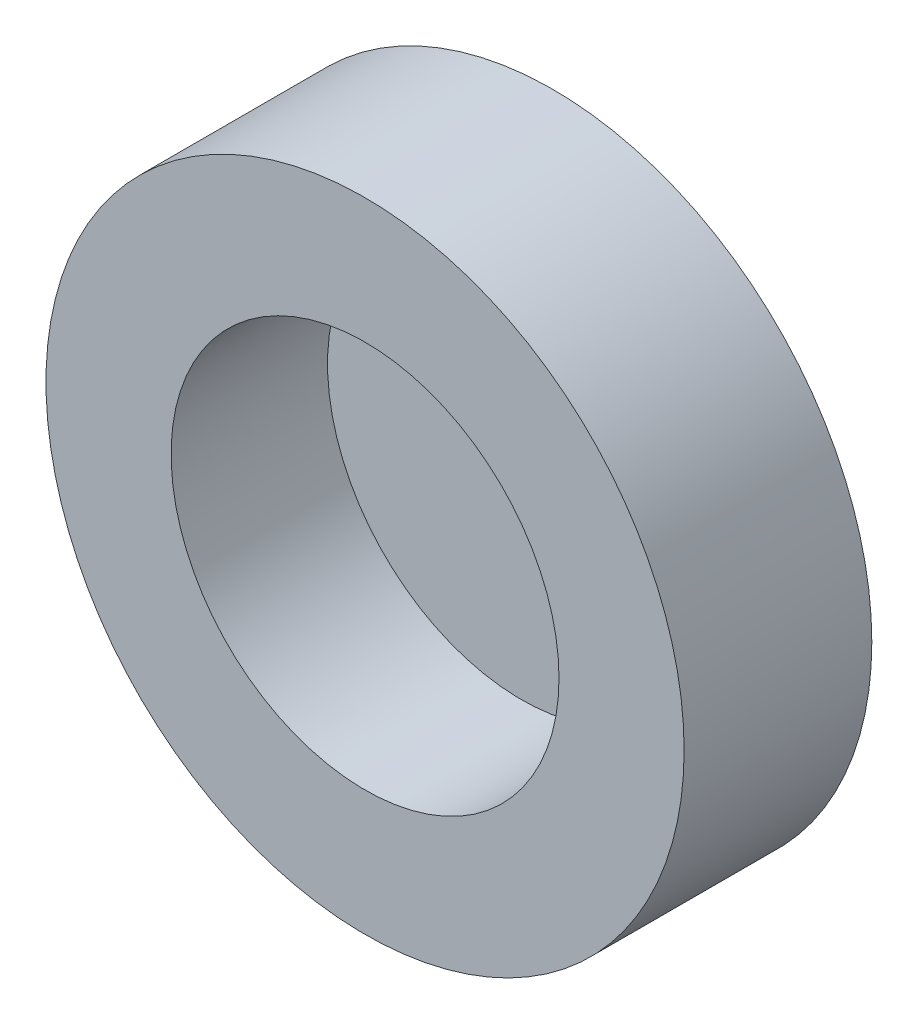
ISO-10303-21;
HEADER;
FILE_DESCRIPTION(('STEP AP214'),'2;1');
FILE_NAME('part.step','',(''),(''),'','','');
FILE_SCHEMA(('AUTOMOTIVE_DESIGN { 1 0 10303 214 1 1 1 1 }'));
ENDSEC;
DATA;
#1=APPLICATION_CONTEXT('core data for automotive mechanical design processes');
#2=APPLICATION_PROTOCOL_DEFINITION('international standard','automotive_design',2000,#1);
#3=PRODUCT_CONTEXT('',#1,'mechanical');
#4=PRODUCT('Part','Part','',(#3));
#5=PRODUCT_RELATED_PRODUCT_CATEGORY('part','',(#4));
#6=PRODUCT_DEFINITION_FORMATION('','',#4);
#7=PRODUCT_DEFINITION_CONTEXT('part definition',#1,'design');
#8=PRODUCT_DEFINITION('design','',#6,#7);
#9=PRODUCT_DEFINITION_SHAPE('','',#8);
#10=(LENGTH_UNIT() NAMED_UNIT(*) SI_UNIT(.MILLI.,.METRE.));
#11=(NAMED_UNIT(*) PLANE_ANGLE_UNIT() SI_UNIT($,.RADIAN.));
#12=(NAMED_UNIT(*) SI_UNIT($,.STERADIAN.) SOLID_ANGLE_UNIT());
#13=UNCERTAINTY_MEASURE_WITH_UNIT(LENGTH_MEASURE(1.E-05),#10,'distance_accuracy_value','');
#14=(GEOMETRIC_REPRESENTATION_CONTEXT(3) GLOBAL_UNCERTAINTY_ASSIGNED_CONTEXT((#13)) GLOBAL_UNIT_ASSIGNED_CONTEXT((#10,
#11,#12)) REPRESENTATION_CONTEXT('',''));
#15=CARTESIAN_POINT('',(0.,0.,0.));
#16=DIRECTION('',(0.,0.,1.));
#17=DIRECTION('',(1.,0.,0.));
#18=AXIS2_PLACEMENT_3D('',#15,#16,#17);
#19=CARTESIAN_POINT('',(0.,0.,5.5));
#20=DIRECTION('',(0.,0.,-1.));
#21=DIRECTION('',(-1.,0.,0.));
#22=AXIS2_PLACEMENT_3D('',#19,#20,#21);
#23=CYLINDRICAL_SURFACE('',#22,1.);
#24=CARTESIAN_POINT('',(0.,0.,0.));
#25=DIRECTION('',(0.,0.,1.));
#26=DIRECTION('',(1.,0.,0.));
#27=AXIS2_PLACEMENT_3D('',#24,#25,#26);
#28=CIRCLE('',#27,1.);
#29=CARTESIAN_POINT('',(1.,0.,0.));
#30=VERTEX_POINT('',#29);
#31=EDGE_CURVE('E44',#30,#30,#28,.T.);
#32=ORIENTED_EDGE('',*,*,#31,.T.);
#33=EDGE_LOOP('',(#32));
#34=FACE_BOUND('',#33,.T.);
#35=CARTESIAN_POINT('',(0.,0.,2.5));
#36=DIRECTION('',(0.,0.,1.));
#37=DIRECTION('',(1.,0.,0.));
#38=AXIS2_PLACEMENT_3D('',#35,#36,#37);
#39=CIRCLE('',#38,1.);
#40=CARTESIAN_POINT('',(1.,0.,2.5));
#41=VERTEX_POINT('',#40);
#42=EDGE_CURVE('E10',#41,#41,#39,.T.);
#43=ORIENTED_EDGE('',*,*,#42,.F.);
#44=EDGE_LOOP('',(#43));
#45=FACE_BOUND('',#44,.T.);
#46=ADVANCED_FACE('F37',(#34,#45),#23,.T.);
#47=CARTESIAN_POINT('',(0.,0.,0.));
#48=DIRECTION('',(0.,0.,1.));
#49=DIRECTION('',(1.,0.,0.));
#50=AXIS2_PLACEMENT_3D('',#47,#48,#49);
#51=PLANE('',#50);
#52=ORIENTED_EDGE('',*,*,#31,.F.);
#53=EDGE_LOOP('',(#52));
#54=FACE_BOUND('',#53,.T.);
#55=ADVANCED_FACE('F86',(#54),#51,.F.);
#56=CARTESIAN_POINT('',(0.,0.,2.5));
#57=DIRECTION('',(0.,0.,1.));
#58=DIRECTION('',(1.,0.,0.));
#59=AXIS2_PLACEMENT_3D('',#56,#57,#58);
#60=CYLINDRICAL_SURFACE('',#59,5.1);
#61=CARTESIAN_POINT('',(0.,0.,2.5));
#62=DIRECTION('',(0.,0.,1.));
#63=DIRECTION('',(1.,0.,0.));
#64=AXIS2_PLACEMENT_3D('',#61,#62,#63);
#65=CIRCLE('',#64,5.1);
#66=CARTESIAN_POINT('',(5.1,0.,2.5));
#67=VERTEX_POINT('',#66);
#68=EDGE_CURVE('E49',#67,#67,#65,.T.);
#69=ORIENTED_EDGE('',*,*,#68,.T.);
#70=EDGE_LOOP('',(#69));
#71=FACE_BOUND('',#70,.T.);
#72=CARTESIAN_POINT('',(0.,0.,5.5));
#73=DIRECTION('',(0.,0.,1.));
#74=DIRECTION('',(1.,0.,0.));
#75=AXIS2_PLACEMENT_3D('',#72,#73,#74);
#76=CIRCLE('',#75,5.1);
#77=CARTESIAN_POINT('',(5.1,0.,5.5));
#78=VERTEX_POINT('',#77);
#79=EDGE_CURVE('E54',#78,#78,#76,.T.);
#80=ORIENTED_EDGE('',*,*,#79,.F.);
#81=EDGE_LOOP('',(#80));
#82=FACE_BOUND('',#81,.T.);
#83=ADVANCED_FACE('F84',(#71,#82),#60,.T.);
#84=CARTESIAN_POINT('',(0.,0.,2.5));
#85=DIRECTION('',(0.,0.,1.));
#86=DIRECTION('',(1.,0.,0.));
#87=AXIS2_PLACEMENT_3D('',#84,#85,#86);
#88=PLANE('',#87);
#89=ORIENTED_EDGE('',*,*,#42,.T.);
#90=EDGE_LOOP('',(#89));
#91=FACE_BOUND('',#90,.T.);
#92=ORIENTED_EDGE('',*,*,#68,.F.);
#93=EDGE_LOOP('',(#92));
#94=FACE_BOUND('',#93,.T.);
#95=ADVANCED_FACE('F80',(#91,#94),#88,.F.);
#96=CARTESIAN_POINT('',(0.,0.,5.5));
#97=DIRECTION('',(0.,0.,1.));
#98=DIRECTION('',(1.,0.,0.));
#99=AXIS2_PLACEMENT_3D('',#96,#97,#98);
#100=PLANE('',#99);
#101=CARTESIAN_POINT('',(0.,0.,5.5));
#102=DIRECTION('',(0.,0.,1.));
#103=DIRECTION('',(1.,0.,0.));
#104=AXIS2_PLACEMENT_3D('',#101,#102,#103);
#105=CIRCLE('',#104,3.1);
#106=CARTESIAN_POINT('',(3.1,0.,5.5));
#107=VERTEX_POINT('',#106);
#108=EDGE_CURVE('E61',#107,#107,#105,.T.);
#109=ORIENTED_EDGE('',*,*,#108,.F.);
#110=EDGE_LOOP('',(#109));
#111=FACE_BOUND('',#110,.T.);
#112=ORIENTED_EDGE('',*,*,#79,.T.);
#113=EDGE_LOOP('',(#112));
#114=FACE_BOUND('',#113,.T.);
#115=ADVANCED_FACE('F74',(#111,#114),#100,.T.);
#116=CARTESIAN_POINT('',(0.,0.,3.));
#117=DIRECTION('',(0.,0.,1.));
#118=DIRECTION('',(1.,0.,0.));
#119=AXIS2_PLACEMENT_3D('',#116,#117,#118);
#120=CYLINDRICAL_SURFACE('',#119,3.1);
#121=CARTESIAN_POINT('',(0.,0.,3.));
#122=DIRECTION('',(0.,0.,1.));
#123=DIRECTION('',(1.,0.,0.));
#124=AXIS2_PLACEMENT_3D('',#121,#122,#123);
#125=CIRCLE('',#124,3.1);
#126=CARTESIAN_POINT('',(3.1,0.,3.));
#127=VERTEX_POINT('',#126);
#128=EDGE_CURVE('E59',#127,#127,#125,.T.);
#129=ORIENTED_EDGE('',*,*,#128,.F.);
#130=EDGE_LOOP('',(#129));
#131=FACE_BOUND('',#130,.T.);
#132=ORIENTED_EDGE('',*,*,#108,.T.);
#133=EDGE_LOOP('',(#132));
#134=FACE_BOUND('',#133,.T.);
#135=ADVANCED_FACE('F71',(#131,#134),#120,.F.);
#136=CARTESIAN_POINT('',(0.,0.,3.));
#137=DIRECTION('',(0.,0.,1.));
#138=DIRECTION('',(1.,0.,0.));
#139=AXIS2_PLACEMENT_3D('',#136,#137,#138);
#140=PLANE('',#139);
#141=ORIENTED_EDGE('',*,*,#128,.T.);
#142=EDGE_LOOP('',(#141));
#143=FACE_BOUND('',#142,.T.);
#144=ADVANCED_FACE('F69',(#143),#140,.T.);
#145=CLOSED_SHELL('',(#46,#55,#83,#95,#115,#135,#144));
#146=MANIFOLD_SOLID_BREP('B2',#145);
#147=ADVANCED_BREP_SHAPE_REPRESENTATION('',(#18,#146),#14);
#148=SHAPE_DEFINITION_REPRESENTATION(#9,#147);
ENDSEC;
END-ISO-10303-21;
